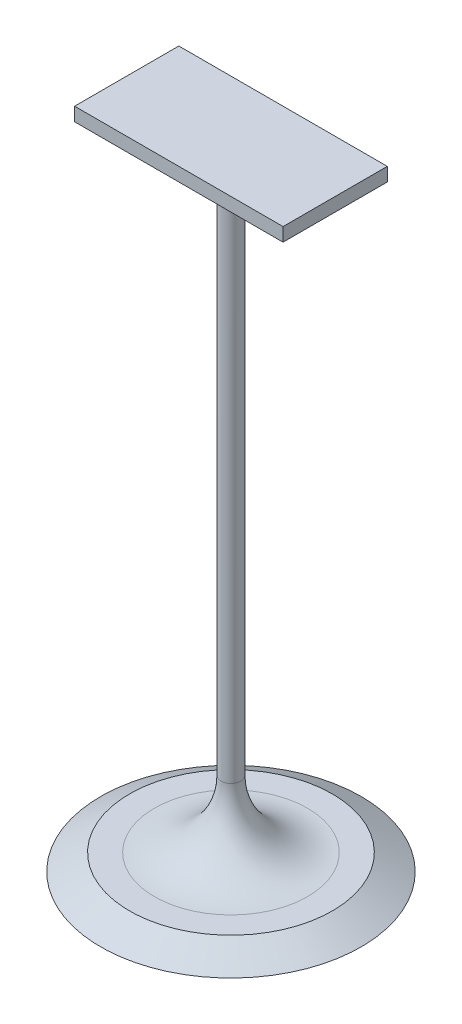
ISO-10303-21;
HEADER;
FILE_DESCRIPTION(('STEP AP214'),'2;1');
FILE_NAME('part.step','',(''),(''),'','','');
FILE_SCHEMA(('AUTOMOTIVE_DESIGN { 1 0 10303 214 1 1 1 1 }'));
ENDSEC;
DATA;
#1=APPLICATION_CONTEXT('core data for automotive mechanical design processes');
#2=APPLICATION_PROTOCOL_DEFINITION('international standard','automotive_design',2000,#1);
#3=PRODUCT_CONTEXT('',#1,'mechanical');
#4=PRODUCT('Part','Part','',(#3));
#5=PRODUCT_RELATED_PRODUCT_CATEGORY('part','',(#4));
#6=PRODUCT_DEFINITION_FORMATION('','',#4);
#7=PRODUCT_DEFINITION_CONTEXT('part definition',#1,'design');
#8=PRODUCT_DEFINITION('design','',#6,#7);
#9=PRODUCT_DEFINITION_SHAPE('','',#8);
#10=(LENGTH_UNIT() NAMED_UNIT(*) SI_UNIT(.MILLI.,.METRE.));
#11=(NAMED_UNIT(*) PLANE_ANGLE_UNIT() SI_UNIT($,.RADIAN.));
#12=(NAMED_UNIT(*) SI_UNIT($,.STERADIAN.) SOLID_ANGLE_UNIT());
#13=UNCERTAINTY_MEASURE_WITH_UNIT(LENGTH_MEASURE(1.E-05),#10,'distance_accuracy_value','');
#14=(GEOMETRIC_REPRESENTATION_CONTEXT(3) GLOBAL_UNCERTAINTY_ASSIGNED_CONTEXT((#13)) GLOBAL_UNIT_ASSIGNED_CONTEXT((#10,
#11,#12)) REPRESENTATION_CONTEXT('',''));
#15=CARTESIAN_POINT('',(0.,0.,0.));
#16=DIRECTION('',(0.,0.,1.));
#17=DIRECTION('',(1.,0.,0.));
#18=AXIS2_PLACEMENT_3D('',#15,#16,#17);
#19=CARTESIAN_POINT('',(0.,0.,0.));
#20=DIRECTION('',(0.,1.,0.));
#21=DIRECTION('',(0.,0.,1.));
#22=AXIS2_PLACEMENT_3D('',#19,#20,#21);
#23=PLANE('',#22);
#24=CARTESIAN_POINT('',(0.,0.,0.));
#25=DIRECTION('',(0.,-1.,0.));
#26=DIRECTION('',(0.,0.,-1.));
#27=AXIS2_PLACEMENT_3D('',#24,#25,#26);
#28=CIRCLE('',#27,12.5);
#29=CARTESIAN_POINT('',(0.,0.,-12.5));
#30=VERTEX_POINT('',#29);
#31=EDGE_CURVE('E118',#30,#30,#28,.T.);
#32=ORIENTED_EDGE('',*,*,#31,.T.);
#33=EDGE_LOOP('',(#32));
#34=FACE_BOUND('',#33,.T.);
#35=ADVANCED_FACE('F35',(#34),#23,.F.);
#36=CARTESIAN_POINT('',(0.,1.6,0.));
#37=DIRECTION('',(0.,-1.,0.));
#38=DIRECTION('',(0.,0.,-1.));
#39=AXIS2_PLACEMENT_3D('',#36,#37,#38);
#40=CONICAL_SURFACE('',#39,9.72871870788976,1.0471975511966);
#41=ORIENTED_EDGE('',*,*,#31,.F.);
#42=EDGE_LOOP('',(#41));
#43=FACE_BOUND('',#42,.T.);
#44=CARTESIAN_POINT('',(0.,1.6,0.));
#45=DIRECTION('',(0.,-1.,0.));
#46=DIRECTION('',(0.,0.,-1.));
#47=AXIS2_PLACEMENT_3D('',#44,#45,#46);
#48=CIRCLE('',#47,9.72871870788976);
#49=CARTESIAN_POINT('',(0.,1.6,-9.72871870788976));
#50=VERTEX_POINT('',#49);
#51=EDGE_CURVE('E115',#50,#50,#48,.T.);
#52=ORIENTED_EDGE('',*,*,#51,.T.);
#53=EDGE_LOOP('',(#52));
#54=FACE_BOUND('',#53,.T.);
#55=ADVANCED_FACE('F141',(#43,#54),#40,.T.);
#56=CARTESIAN_POINT('',(-9.72871870788976,1.6,0.));
#57=DIRECTION('',(0.,-1.,0.));
#58=DIRECTION('',(0.,0.,-1.));
#59=AXIS2_PLACEMENT_3D('',#56,#57,#58);
#60=PLANE('',#59);
#61=CARTESIAN_POINT('',(0.,1.6,0.));
#62=DIRECTION('',(0.,-1.,0.));
#63=DIRECTION('',(0.,0.,-1.));
#64=AXIS2_PLACEMENT_3D('',#61,#62,#63);
#65=CIRCLE('',#64,7.35);
#66=CARTESIAN_POINT('',(0.,1.6,-7.35));
#67=VERTEX_POINT('',#66);
#68=EDGE_CURVE('E44',#67,#67,#65,.T.);
#69=ORIENTED_EDGE('',*,*,#68,.T.);
#70=EDGE_LOOP('',(#69));
#71=FACE_BOUND('',#70,.T.);
#72=ORIENTED_EDGE('',*,*,#51,.F.);
#73=EDGE_LOOP('',(#72));
#74=FACE_BOUND('',#73,.T.);
#75=ADVANCED_FACE('F123',(#71,#74),#60,.F.);
#76=CARTESIAN_POINT('',(0.,-7.35712125151977,0.));
#77=DIRECTION('',(0.,-1.,0.));
#78=DIRECTION('',(0.,0.,-1.));
#79=AXIS2_PLACEMENT_3D('',#76,#77,#78);
#80=CYLINDRICAL_SURFACE('',#79,0.949999999999999);
#81=CARTESIAN_POINT('',(0.,8.,0.));
#82=DIRECTION('',(0.,-1.,0.));
#83=DIRECTION('',(0.,0.,-1.));
#84=AXIS2_PLACEMENT_3D('',#81,#82,#83);
#85=CIRCLE('',#84,0.949999999999999);
#86=CARTESIAN_POINT('',(0.,8.,-0.949999999999999));
#87=VERTEX_POINT('',#86);
#88=EDGE_CURVE('E11',#87,#87,#85,.F.);
#89=ORIENTED_EDGE('',*,*,#88,.T.);
#90=EDGE_LOOP('',(#89));
#91=FACE_BOUND('',#90,.T.);
#92=CARTESIAN_POINT('',(0.,59.8,0.));
#93=DIRECTION('',(0.,1.,0.));
#94=DIRECTION('',(0.,0.,1.));
#95=AXIS2_PLACEMENT_3D('',#92,#93,#94);
#96=CIRCLE('',#95,0.949999999999999);
#97=CARTESIAN_POINT('',(0.,59.8,0.949999999999999));
#98=VERTEX_POINT('',#97);
#99=EDGE_CURVE('E112',#98,#98,#96,.T.);
#100=ORIENTED_EDGE('',*,*,#99,.F.);
#101=EDGE_LOOP('',(#100));
#102=FACE_BOUND('',#101,.T.);
#103=ADVANCED_FACE('F128',(#91,#102),#80,.T.);
#104=CARTESIAN_POINT('',(0.,8.,0.));
#105=DIRECTION('',(0.,-1.,0.));
#106=DIRECTION('',(0.,0.,-1.));
#107=AXIS2_PLACEMENT_3D('',#104,#105,#106);
#108=TOROIDAL_SURFACE('',#107,7.35,6.4);
#109=ORIENTED_EDGE('',*,*,#88,.F.);
#110=EDGE_LOOP('',(#109));
#111=FACE_BOUND('',#110,.T.);
#112=ORIENTED_EDGE('',*,*,#68,.F.);
#113=EDGE_LOOP('',(#112));
#114=FACE_BOUND('',#113,.T.);
#115=ADVANCED_FACE('F37',(#111,#114),#108,.F.);
#116=CARTESIAN_POINT('',(0.,59.8,0.));
#117=DIRECTION('',(0.,1.,0.));
#118=DIRECTION('',(0.,0.,1.));
#119=AXIS2_PLACEMENT_3D('',#116,#117,#118);
#120=PLANE('',#119);
#121=DIRECTION('',(0.,0.,-1.));
#122=VECTOR('',#121,1.);
#123=CARTESIAN_POINT('',(9.99999999999999,59.8,-5.));
#124=LINE('',#123,#122);
#125=CARTESIAN_POINT('',(10.,59.8,5.));
#126=VERTEX_POINT('',#125);
#127=CARTESIAN_POINT('',(9.99999999999999,59.8,-5.));
#128=VERTEX_POINT('',#127);
#129=EDGE_CURVE('E103',#126,#128,#124,.T.);
#130=ORIENTED_EDGE('',*,*,#129,.F.);
#131=DIRECTION('',(1.,0.,0.));
#132=VECTOR('',#131,1.);
#133=CARTESIAN_POINT('',(-10.,59.8,5.));
#134=LINE('',#133,#132);
#135=CARTESIAN_POINT('',(-10.,59.8,5.));
#136=VERTEX_POINT('',#135);
#137=EDGE_CURVE('E75',#136,#126,#134,.T.);
#138=ORIENTED_EDGE('',*,*,#137,.F.);
#139=DIRECTION('',(0.,0.,1.));
#140=VECTOR('',#139,1.);
#141=CARTESIAN_POINT('',(-10.,59.8,-5.));
#142=LINE('',#141,#140);
#143=CARTESIAN_POINT('',(-10.,59.8,-5.));
#144=VERTEX_POINT('',#143);
#145=EDGE_CURVE('E69',#144,#136,#142,.T.);
#146=ORIENTED_EDGE('',*,*,#145,.F.);
#147=DIRECTION('',(-1.,0.,0.));
#148=VECTOR('',#147,1.);
#149=CARTESIAN_POINT('',(-10.,59.8,-5.));
#150=LINE('',#149,#148);
#151=EDGE_CURVE('E93',#128,#144,#150,.T.);
#152=ORIENTED_EDGE('',*,*,#151,.F.);
#153=EDGE_LOOP('',(#130,#138,#146,#152));
#154=FACE_BOUND('',#153,.T.);
#155=ORIENTED_EDGE('',*,*,#99,.T.);
#156=EDGE_LOOP('',(#155));
#157=FACE_BOUND('',#156,.T.);
#158=ADVANCED_FACE('F127',(#154,#157),#120,.F.);
#159=CARTESIAN_POINT('',(9.99999999999999,61.1,-5.));
#160=DIRECTION('',(-1.,0.,0.));
#161=DIRECTION('',(0.,0.,1.));
#162=AXIS2_PLACEMENT_3D('',#159,#160,#161);
#163=PLANE('',#162);
#164=ORIENTED_EDGE('',*,*,#129,.T.);
#165=DIRECTION('',(0.,-1.,0.));
#166=VECTOR('',#165,1.);
#167=CARTESIAN_POINT('',(9.99999999999999,61.1,-5.));
#168=LINE('',#167,#166);
#169=CARTESIAN_POINT('',(9.99999999999999,61.1,-5.));
#170=VERTEX_POINT('',#169);
#171=EDGE_CURVE('E94',#170,#128,#168,.T.);
#172=ORIENTED_EDGE('',*,*,#171,.F.);
#173=DIRECTION('',(0.,0.,-1.));
#174=VECTOR('',#173,1.);
#175=CARTESIAN_POINT('',(9.99999999999999,61.1,-5.));
#176=LINE('',#175,#174);
#177=CARTESIAN_POINT('',(10.,61.1,5.));
#178=VERTEX_POINT('',#177);
#179=EDGE_CURVE('E88',#178,#170,#176,.T.);
#180=ORIENTED_EDGE('',*,*,#179,.F.);
#181=DIRECTION('',(0.,-1.,0.));
#182=VECTOR('',#181,1.);
#183=CARTESIAN_POINT('',(10.,61.1,5.));
#184=LINE('',#183,#182);
#185=EDGE_CURVE('E99',#178,#126,#184,.T.);
#186=ORIENTED_EDGE('',*,*,#185,.T.);
#187=EDGE_LOOP('',(#164,#172,#180,#186));
#188=FACE_BOUND('',#187,.T.);
#189=ADVANCED_FACE('F134',(#188),#163,.F.);
#190=CARTESIAN_POINT('',(-10.,61.1,-5.));
#191=DIRECTION('',(0.,0.,1.));
#192=DIRECTION('',(1.,0.,0.));
#193=AXIS2_PLACEMENT_3D('',#190,#191,#192);
#194=PLANE('',#193);
#195=ORIENTED_EDGE('',*,*,#151,.T.);
#196=DIRECTION('',(0.,-1.,0.));
#197=VECTOR('',#196,1.);
#198=CARTESIAN_POINT('',(-10.,61.1,-5.));
#199=LINE('',#198,#197);
#200=CARTESIAN_POINT('',(-10.,61.1,-5.));
#201=VERTEX_POINT('',#200);
#202=EDGE_CURVE('E91',#201,#144,#199,.T.);
#203=ORIENTED_EDGE('',*,*,#202,.F.);
#204=DIRECTION('',(-1.,0.,0.));
#205=VECTOR('',#204,1.);
#206=CARTESIAN_POINT('',(-10.,61.1,-5.));
#207=LINE('',#206,#205);
#208=EDGE_CURVE('E83',#170,#201,#207,.T.);
#209=ORIENTED_EDGE('',*,*,#208,.F.);
#210=ORIENTED_EDGE('',*,*,#171,.T.);
#211=EDGE_LOOP('',(#195,#203,#209,#210));
#212=FACE_BOUND('',#211,.T.);
#213=ADVANCED_FACE('F92',(#212),#194,.F.);
#214=CARTESIAN_POINT('',(-10.,61.1,-5.));
#215=DIRECTION('',(1.,0.,0.));
#216=DIRECTION('',(0.,0.,-1.));
#217=AXIS2_PLACEMENT_3D('',#214,#215,#216);
#218=PLANE('',#217);
#219=ORIENTED_EDGE('',*,*,#145,.T.);
#220=DIRECTION('',(0.,-1.,0.));
#221=VECTOR('',#220,1.);
#222=CARTESIAN_POINT('',(-10.,61.1,5.));
#223=LINE('',#222,#221);
#224=CARTESIAN_POINT('',(-10.,61.1,5.));
#225=VERTEX_POINT('',#224);
#226=EDGE_CURVE('E95',#225,#136,#223,.T.);
#227=ORIENTED_EDGE('',*,*,#226,.F.);
#228=DIRECTION('',(0.,0.,1.));
#229=VECTOR('',#228,1.);
#230=CARTESIAN_POINT('',(-10.,61.1,-5.));
#231=LINE('',#230,#229);
#232=EDGE_CURVE('E86',#201,#225,#231,.T.);
#233=ORIENTED_EDGE('',*,*,#232,.F.);
#234=ORIENTED_EDGE('',*,*,#202,.T.);
#235=EDGE_LOOP('',(#219,#227,#233,#234));
#236=FACE_BOUND('',#235,.T.);
#237=ADVANCED_FACE('F97',(#236),#218,.F.);
#238=CARTESIAN_POINT('',(-10.,61.1,5.));
#239=DIRECTION('',(0.,0.,-1.));
#240=DIRECTION('',(-1.,0.,0.));
#241=AXIS2_PLACEMENT_3D('',#238,#239,#240);
#242=PLANE('',#241);
#243=ORIENTED_EDGE('',*,*,#137,.T.);
#244=ORIENTED_EDGE('',*,*,#185,.F.);
#245=DIRECTION('',(1.,0.,0.));
#246=VECTOR('',#245,1.);
#247=CARTESIAN_POINT('',(-10.,61.1,5.));
#248=LINE('',#247,#246);
#249=EDGE_CURVE('E52',#225,#178,#248,.T.);
#250=ORIENTED_EDGE('',*,*,#249,.F.);
#251=ORIENTED_EDGE('',*,*,#226,.T.);
#252=EDGE_LOOP('',(#243,#244,#250,#251));
#253=FACE_BOUND('',#252,.T.);
#254=ADVANCED_FACE('F158',(#253),#242,.F.);
#255=CARTESIAN_POINT('',(0.,61.1,0.));
#256=DIRECTION('',(0.,1.,0.));
#257=DIRECTION('',(0.,0.,1.));
#258=AXIS2_PLACEMENT_3D('',#255,#256,#257);
#259=PLANE('',#258);
#260=ORIENTED_EDGE('',*,*,#179,.T.);
#261=ORIENTED_EDGE('',*,*,#208,.T.);
#262=ORIENTED_EDGE('',*,*,#232,.T.);
#263=ORIENTED_EDGE('',*,*,#249,.T.);
#264=EDGE_LOOP('',(#260,#261,#262,#263));
#265=FACE_BOUND('',#264,.T.);
#266=ADVANCED_FACE('F84',(#265),#259,.T.);
#267=CLOSED_SHELL('',(#35,#55,#75,#103,#115,#158,#189,#213,#237,#254,#266));
#268=MANIFOLD_SOLID_BREP('B2',#267);
#269=ADVANCED_BREP_SHAPE_REPRESENTATION('',(#18,#268),#14);
#270=SHAPE_DEFINITION_REPRESENTATION(#9,#269);
ENDSEC;
END-ISO-10303-21;
